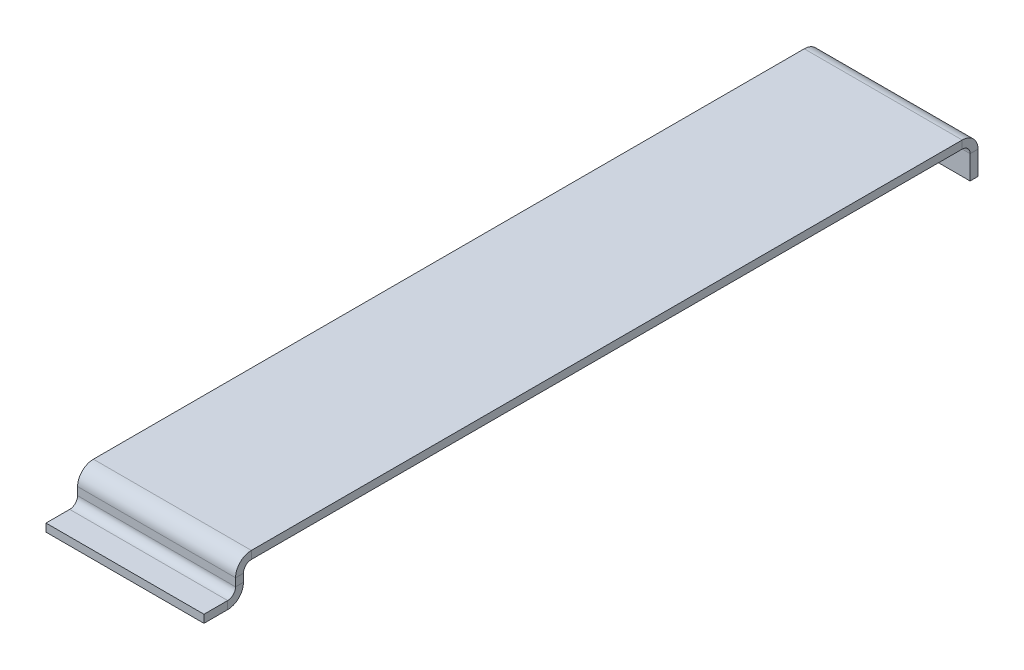
ISO-10303-21;
HEADER;
FILE_DESCRIPTION(('STEP AP214'),'2;1');
FILE_NAME('part.step','',(''),(''),'','','');
FILE_SCHEMA(('AUTOMOTIVE_DESIGN { 1 0 10303 214 1 1 1 1 }'));
ENDSEC;
DATA;
#1=APPLICATION_CONTEXT('core data for automotive mechanical design processes');
#2=APPLICATION_PROTOCOL_DEFINITION('international standard','automotive_design',2000,#1);
#3=PRODUCT_CONTEXT('',#1,'mechanical');
#4=PRODUCT('Part','Part','',(#3));
#5=PRODUCT_RELATED_PRODUCT_CATEGORY('part','',(#4));
#6=PRODUCT_DEFINITION_FORMATION('','',#4);
#7=PRODUCT_DEFINITION_CONTEXT('part definition',#1,'design');
#8=PRODUCT_DEFINITION('design','',#6,#7);
#9=PRODUCT_DEFINITION_SHAPE('','',#8);
#10=(LENGTH_UNIT() NAMED_UNIT(*) SI_UNIT(.MILLI.,.METRE.));
#11=(NAMED_UNIT(*) PLANE_ANGLE_UNIT() SI_UNIT($,.RADIAN.));
#12=(NAMED_UNIT(*) SI_UNIT($,.STERADIAN.) SOLID_ANGLE_UNIT());
#13=UNCERTAINTY_MEASURE_WITH_UNIT(LENGTH_MEASURE(1.E-05),#10,'distance_accuracy_value','');
#14=(GEOMETRIC_REPRESENTATION_CONTEXT(3) GLOBAL_UNCERTAINTY_ASSIGNED_CONTEXT((#13)) GLOBAL_UNIT_ASSIGNED_CONTEXT((#10,
#11,#12)) REPRESENTATION_CONTEXT('',''));
#15=CARTESIAN_POINT('',(0.,0.,0.));
#16=DIRECTION('',(0.,0.,1.));
#17=DIRECTION('',(1.,0.,0.));
#18=AXIS2_PLACEMENT_3D('',#15,#16,#17);
#19=CARTESIAN_POINT('',(-20.,-9.99999999999999,94.));
#20=DIRECTION('',(1.,0.,0.));
#21=DIRECTION('',(0.,0.,-1.));
#22=AXIS2_PLACEMENT_3D('',#19,#20,#21);
#23=PLANE('',#22);
#24=DIRECTION('',(0.,0.,-1.));
#25=VECTOR('',#24,1.);
#26=CARTESIAN_POINT('',(-20.,-5.99999999999999,94.));
#27=LINE('',#26,#25);
#28=CARTESIAN_POINT('',(-20.,-5.99999999999999,94.));
#29=VERTEX_POINT('',#28);
#30=CARTESIAN_POINT('',(-20.,-5.99999999999998,92.));
#31=VERTEX_POINT('',#30);
#32=EDGE_CURVE('E269',#29,#31,#27,.T.);
#33=ORIENTED_EDGE('',*,*,#32,.F.);
#34=DIRECTION('',(0.,-1.,0.));
#35=VECTOR('',#34,1.);
#36=CARTESIAN_POINT('',(-20.,3.19233188353512E-13,94.));
#37=LINE('',#36,#35);
#38=CARTESIAN_POINT('',(-20.,-3.99999999999999,94.));
#39=VERTEX_POINT('',#38);
#40=EDGE_CURVE('E319',#39,#29,#37,.T.);
#41=ORIENTED_EDGE('',*,*,#40,.F.);
#42=DIRECTION('',(0.,0.,-1.));
#43=VECTOR('',#42,1.);
#44=CARTESIAN_POINT('',(-20.,-3.99999999999999,92.));
#45=LINE('',#44,#43);
#46=CARTESIAN_POINT('',(-20.,-3.99999999999998,92.));
#47=VERTEX_POINT('',#46);
#48=EDGE_CURVE('E329',#47,#39,#45,.F.);
#49=ORIENTED_EDGE('',*,*,#48,.F.);
#50=DIRECTION('',(0.,1.,0.));
#51=VECTOR('',#50,1.);
#52=CARTESIAN_POINT('',(-20.,-9.99999999999999,92.));
#53=LINE('',#52,#51);
#54=EDGE_CURVE('E324',#47,#31,#53,.F.);
#55=ORIENTED_EDGE('',*,*,#54,.T.);
#56=EDGE_LOOP('',(#33,#41,#49,#55));
#57=FACE_BOUND('',#56,.T.);
#58=ADVANCED_FACE('F97',(#57),#23,.F.);
#59=CARTESIAN_POINT('',(20.,-1.99999999999999,94.));
#60=DIRECTION('',(-1.,0.,0.));
#61=DIRECTION('',(0.,0.,1.));
#62=AXIS2_PLACEMENT_3D('',#59,#60,#61);
#63=PLANE('',#62);
#64=DIRECTION('',(0.,0.,-1.));
#65=VECTOR('',#64,1.);
#66=CARTESIAN_POINT('',(20.,-5.99999999999999,94.));
#67=LINE('',#66,#65);
#68=CARTESIAN_POINT('',(20.,-5.99999999999999,94.));
#69=VERTEX_POINT('',#68);
#70=CARTESIAN_POINT('',(20.,-6.,92.));
#71=VERTEX_POINT('',#70);
#72=EDGE_CURVE('E258',#69,#71,#67,.T.);
#73=ORIENTED_EDGE('',*,*,#72,.T.);
#74=DIRECTION('',(0.,-1.,0.));
#75=VECTOR('',#74,1.);
#76=CARTESIAN_POINT('',(20.,-2.,92.));
#77=LINE('',#76,#75);
#78=CARTESIAN_POINT('',(20.,-3.99999999999998,92.));
#79=VERTEX_POINT('',#78);
#80=EDGE_CURVE('E322',#71,#79,#77,.F.);
#81=ORIENTED_EDGE('',*,*,#80,.T.);
#82=DIRECTION('',(0.,0.,-1.));
#83=VECTOR('',#82,1.);
#84=CARTESIAN_POINT('',(20.,-3.99999999999999,94.));
#85=LINE('',#84,#83);
#86=CARTESIAN_POINT('',(20.,-3.99999999999998,94.));
#87=VERTEX_POINT('',#86);
#88=EDGE_CURVE('E307',#79,#87,#85,.F.);
#89=ORIENTED_EDGE('',*,*,#88,.T.);
#90=DIRECTION('',(0.,1.,0.));
#91=VECTOR('',#90,1.);
#92=CARTESIAN_POINT('',(20.,3.19233188353512E-13,94.));
#93=LINE('',#92,#91);
#94=EDGE_CURVE('E316',#69,#87,#93,.T.);
#95=ORIENTED_EDGE('',*,*,#94,.F.);
#96=EDGE_LOOP('',(#73,#81,#89,#95));
#97=FACE_BOUND('',#96,.T.);
#98=ADVANCED_FACE('F405',(#97),#63,.F.);
#99=CARTESIAN_POINT('',(0.,3.19233188353512E-13,94.));
#100=DIRECTION('',(0.,0.,-1.));
#101=DIRECTION('',(0.,1.,0.));
#102=AXIS2_PLACEMENT_3D('',#99,#100,#101);
#103=PLANE('',#102);
#104=DIRECTION('',(1.,0.,0.));
#105=VECTOR('',#104,1.);
#106=CARTESIAN_POINT('',(20.,-5.99999999999999,94.));
#107=LINE('',#106,#105);
#108=EDGE_CURVE('E264',#69,#29,#107,.F.);
#109=ORIENTED_EDGE('',*,*,#108,.F.);
#110=ORIENTED_EDGE('',*,*,#94,.T.);
#111=DIRECTION('',(-1.,0.,0.));
#112=VECTOR('',#111,1.);
#113=CARTESIAN_POINT('',(20.,-3.99999999999999,94.));
#114=LINE('',#113,#112);
#115=EDGE_CURVE('E327',#39,#87,#114,.F.);
#116=ORIENTED_EDGE('',*,*,#115,.F.);
#117=ORIENTED_EDGE('',*,*,#40,.T.);
#118=EDGE_LOOP('',(#109,#110,#116,#117));
#119=FACE_BOUND('',#118,.T.);
#120=ADVANCED_FACE('F415',(#119),#103,.F.);
#121=CARTESIAN_POINT('',(0.,3.12250225675826E-13,92.));
#122=DIRECTION('',(0.,0.,-1.));
#123=DIRECTION('',(0.,1.,0.));
#124=AXIS2_PLACEMENT_3D('',#121,#122,#123);
#125=PLANE('',#124);
#126=ORIENTED_EDGE('',*,*,#80,.F.);
#127=DIRECTION('',(1.,0.,0.));
#128=VECTOR('',#127,1.);
#129=CARTESIAN_POINT('',(20.,-6.,92.));
#130=LINE('',#129,#128);
#131=EDGE_CURVE('E253',#71,#31,#130,.F.);
#132=ORIENTED_EDGE('',*,*,#131,.T.);
#133=ORIENTED_EDGE('',*,*,#54,.F.);
#134=DIRECTION('',(-1.,0.,0.));
#135=VECTOR('',#134,1.);
#136=CARTESIAN_POINT('',(20.,-3.99999999999999,92.));
#137=LINE('',#136,#135);
#138=EDGE_CURVE('E332',#79,#47,#137,.T.);
#139=ORIENTED_EDGE('',*,*,#138,.F.);
#140=EDGE_LOOP('',(#126,#132,#133,#139));
#141=FACE_BOUND('',#140,.T.);
#142=ADVANCED_FACE('F408',(#141),#125,.T.);
#143=CARTESIAN_POINT('',(20.,-2.,-90.));
#144=DIRECTION('',(1.,0.,0.));
#145=DIRECTION('',(0.,0.,-1.));
#146=AXIS2_PLACEMENT_3D('',#143,#144,#145);
#147=PLANE('',#146);
#148=DIRECTION('',(0.,0.,-1.));
#149=VECTOR('',#148,1.);
#150=CARTESIAN_POINT('',(20.,0.,-90.));
#151=LINE('',#150,#149);
#152=CARTESIAN_POINT('',(20.,0.,90.));
#153=VERTEX_POINT('',#152);
#154=CARTESIAN_POINT('',(20.,0.,-90.));
#155=VERTEX_POINT('',#154);
#156=EDGE_CURVE('E337',#153,#155,#151,.T.);
#157=ORIENTED_EDGE('',*,*,#156,.F.);
#158=DIRECTION('',(0.,1.,0.));
#159=VECTOR('',#158,1.);
#160=CARTESIAN_POINT('',(20.,-2.,90.));
#161=LINE('',#160,#159);
#162=CARTESIAN_POINT('',(20.,-2.00000000000002,90.));
#163=VERTEX_POINT('',#162);
#164=EDGE_CURVE('E13',#163,#153,#161,.T.);
#165=ORIENTED_EDGE('',*,*,#164,.F.);
#166=DIRECTION('',(0.,0.,-1.));
#167=VECTOR('',#166,1.);
#168=CARTESIAN_POINT('',(20.,-2.,-90.));
#169=LINE('',#168,#167);
#170=CARTESIAN_POINT('',(20.,-2.00000000000003,-90.));
#171=VERTEX_POINT('',#170);
#172=EDGE_CURVE('E346',#163,#171,#169,.T.);
#173=ORIENTED_EDGE('',*,*,#172,.T.);
#174=DIRECTION('',(0.,1.,0.));
#175=VECTOR('',#174,1.);
#176=CARTESIAN_POINT('',(20.,-2.,-90.));
#177=LINE('',#176,#175);
#178=EDGE_CURVE('E101',#171,#155,#177,.T.);
#179=ORIENTED_EDGE('',*,*,#178,.T.);
#180=EDGE_LOOP('',(#157,#165,#173,#179));
#181=FACE_BOUND('',#180,.T.);
#182=ADVANCED_FACE('F99',(#181),#147,.T.);
#183=CARTESIAN_POINT('',(-20.,-2.,-90.));
#184=DIRECTION('',(-1.,0.,0.));
#185=DIRECTION('',(0.,0.,1.));
#186=AXIS2_PLACEMENT_3D('',#183,#184,#185);
#187=PLANE('',#186);
#188=DIRECTION('',(0.,0.,1.));
#189=VECTOR('',#188,1.);
#190=CARTESIAN_POINT('',(-20.,0.,-90.));
#191=LINE('',#190,#189);
#192=CARTESIAN_POINT('',(-20.,0.,-90.));
#193=VERTEX_POINT('',#192);
#194=CARTESIAN_POINT('',(-20.,0.,90.));
#195=VERTEX_POINT('',#194);
#196=EDGE_CURVE('E362',#193,#195,#191,.T.);
#197=ORIENTED_EDGE('',*,*,#196,.F.);
#198=DIRECTION('',(0.,1.,0.));
#199=VECTOR('',#198,1.);
#200=CARTESIAN_POINT('',(-20.,-2.,-90.));
#201=LINE('',#200,#199);
#202=CARTESIAN_POINT('',(-20.,-2.00000000000003,-90.));
#203=VERTEX_POINT('',#202);
#204=EDGE_CURVE('E368',#203,#193,#201,.T.);
#205=ORIENTED_EDGE('',*,*,#204,.F.);
#206=DIRECTION('',(0.,0.,1.));
#207=VECTOR('',#206,1.);
#208=CARTESIAN_POINT('',(-20.,-2.,-90.));
#209=LINE('',#208,#207);
#210=CARTESIAN_POINT('',(-20.,-2.00000000000002,90.));
#211=VERTEX_POINT('',#210);
#212=EDGE_CURVE('E352',#203,#211,#209,.T.);
#213=ORIENTED_EDGE('',*,*,#212,.T.);
#214=DIRECTION('',(0.,1.,0.));
#215=VECTOR('',#214,1.);
#216=CARTESIAN_POINT('',(-20.,-2.,90.));
#217=LINE('',#216,#215);
#218=EDGE_CURVE('E106',#211,#195,#217,.T.);
#219=ORIENTED_EDGE('',*,*,#218,.T.);
#220=EDGE_LOOP('',(#197,#205,#213,#219));
#221=FACE_BOUND('',#220,.T.);
#222=ADVANCED_FACE('F390',(#221),#187,.T.);
#223=CARTESIAN_POINT('',(0.,-2.,0.));
#224=DIRECTION('',(0.,1.,0.));
#225=DIRECTION('',(0.,0.,1.));
#226=AXIS2_PLACEMENT_3D('',#223,#224,#225);
#227=PLANE('',#226);
#228=ORIENTED_EDGE('',*,*,#172,.F.);
#229=DIRECTION('',(1.,0.,0.));
#230=VECTOR('',#229,1.);
#231=CARTESIAN_POINT('',(-20.,-2.,90.));
#232=LINE('',#231,#230);
#233=EDGE_CURVE('E355',#211,#163,#232,.T.);
#234=ORIENTED_EDGE('',*,*,#233,.F.);
#235=ORIENTED_EDGE('',*,*,#212,.F.);
#236=DIRECTION('',(-1.,0.,0.));
#237=VECTOR('',#236,1.);
#238=CARTESIAN_POINT('',(-20.,-2.,-90.));
#239=LINE('',#238,#237);
#240=EDGE_CURVE('E349',#171,#203,#239,.T.);
#241=ORIENTED_EDGE('',*,*,#240,.F.);
#242=EDGE_LOOP('',(#228,#234,#235,#241));
#243=FACE_BOUND('',#242,.T.);
#244=ADVANCED_FACE('F395',(#243),#227,.F.);
#245=CARTESIAN_POINT('',(0.,0.,0.));
#246=DIRECTION('',(0.,1.,0.));
#247=DIRECTION('',(0.,0.,1.));
#248=AXIS2_PLACEMENT_3D('',#245,#246,#247);
#249=PLANE('',#248);
#250=ORIENTED_EDGE('',*,*,#156,.T.);
#251=DIRECTION('',(-1.,0.,0.));
#252=VECTOR('',#251,1.);
#253=CARTESIAN_POINT('',(-20.,0.,-90.));
#254=LINE('',#253,#252);
#255=EDGE_CURVE('E359',#155,#193,#254,.T.);
#256=ORIENTED_EDGE('',*,*,#255,.T.);
#257=ORIENTED_EDGE('',*,*,#196,.T.);
#258=DIRECTION('',(1.,0.,0.));
#259=VECTOR('',#258,1.);
#260=CARTESIAN_POINT('',(-20.,0.,90.));
#261=LINE('',#260,#259);
#262=EDGE_CURVE('E350',#195,#153,#261,.T.);
#263=ORIENTED_EDGE('',*,*,#262,.T.);
#264=EDGE_LOOP('',(#250,#256,#257,#263));
#265=FACE_BOUND('',#264,.T.);
#266=ADVANCED_FACE('F382',(#265),#249,.T.);
#267=CARTESIAN_POINT('',(20.,-3.99999999999999,90.));
#268=DIRECTION('',(1.,0.,0.));
#269=DIRECTION('',(0.,0.,-1.));
#270=AXIS2_PLACEMENT_3D('',#267,#268,#269);
#271=PLANE('',#270);
#272=ORIENTED_EDGE('',*,*,#88,.F.);
#273=CARTESIAN_POINT('',(20.,-3.99999999999999,90.));
#274=DIRECTION('',(-1.,0.,0.));
#275=DIRECTION('',(0.,0.,1.));
#276=AXIS2_PLACEMENT_3D('',#273,#274,#275);
#277=CIRCLE('',#276,1.99999999999997);
#278=EDGE_CURVE('E341',#163,#79,#277,.F.);
#279=ORIENTED_EDGE('',*,*,#278,.F.);
#280=ORIENTED_EDGE('',*,*,#164,.T.);
#281=CARTESIAN_POINT('',(20.,-3.99999999999999,90.));
#282=DIRECTION('',(-1.,0.,0.));
#283=DIRECTION('',(0.,0.,1.));
#284=AXIS2_PLACEMENT_3D('',#281,#282,#283);
#285=CIRCLE('',#284,3.99999999999997);
#286=EDGE_CURVE('E122',#153,#87,#285,.F.);
#287=ORIENTED_EDGE('',*,*,#286,.T.);
#288=EDGE_LOOP('',(#272,#279,#280,#287));
#289=FACE_BOUND('',#288,.T.);
#290=ADVANCED_FACE('F402',(#289),#271,.T.);
#291=CARTESIAN_POINT('',(-20.,-3.99999999999999,90.));
#292=DIRECTION('',(1.,0.,0.));
#293=DIRECTION('',(0.,0.,-1.));
#294=AXIS2_PLACEMENT_3D('',#291,#292,#293);
#295=PLANE('',#294);
#296=CARTESIAN_POINT('',(-20.,-3.99999999999999,90.));
#297=DIRECTION('',(-1.,0.,0.));
#298=DIRECTION('',(0.,0.,1.));
#299=AXIS2_PLACEMENT_3D('',#296,#297,#298);
#300=CIRCLE('',#299,1.99999999999997);
#301=EDGE_CURVE('E318',#47,#211,#300,.T.);
#302=ORIENTED_EDGE('',*,*,#301,.F.);
#303=ORIENTED_EDGE('',*,*,#48,.T.);
#304=CARTESIAN_POINT('',(-20.,-3.99999999999999,90.));
#305=DIRECTION('',(-1.,0.,0.));
#306=DIRECTION('',(0.,0.,1.));
#307=AXIS2_PLACEMENT_3D('',#304,#305,#306);
#308=CIRCLE('',#307,3.99999999999997);
#309=EDGE_CURVE('E338',#39,#195,#308,.T.);
#310=ORIENTED_EDGE('',*,*,#309,.T.);
#311=ORIENTED_EDGE('',*,*,#218,.F.);
#312=EDGE_LOOP('',(#302,#303,#310,#311));
#313=FACE_BOUND('',#312,.T.);
#314=ADVANCED_FACE('F386',(#313),#295,.F.);
#315=CARTESIAN_POINT('',(-20.,-3.99999999999999,90.));
#316=DIRECTION('',(-1.,0.,0.));
#317=DIRECTION('',(0.,0.,1.));
#318=AXIS2_PLACEMENT_3D('',#315,#316,#317);
#319=CYLINDRICAL_SURFACE('',#318,3.99999999999997);
#320=ORIENTED_EDGE('',*,*,#262,.F.);
#321=ORIENTED_EDGE('',*,*,#309,.F.);
#322=ORIENTED_EDGE('',*,*,#115,.T.);
#323=ORIENTED_EDGE('',*,*,#286,.F.);
#324=EDGE_LOOP('',(#320,#321,#322,#323));
#325=FACE_BOUND('',#324,.T.);
#326=ADVANCED_FACE('F383',(#325),#319,.T.);
#327=CARTESIAN_POINT('',(-20.,-3.99999999999999,90.));
#328=DIRECTION('',(-1.,0.,0.));
#329=DIRECTION('',(0.,0.,1.));
#330=AXIS2_PLACEMENT_3D('',#327,#328,#329);
#331=CYLINDRICAL_SURFACE('',#330,1.99999999999997);
#332=ORIENTED_EDGE('',*,*,#233,.T.);
#333=ORIENTED_EDGE('',*,*,#278,.T.);
#334=ORIENTED_EDGE('',*,*,#138,.T.);
#335=ORIENTED_EDGE('',*,*,#301,.T.);
#336=EDGE_LOOP('',(#332,#333,#334,#335));
#337=FACE_BOUND('',#336,.T.);
#338=ADVANCED_FACE('F398',(#337),#331,.F.);
#339=CARTESIAN_POINT('',(-20.,-4.,-90.));
#340=DIRECTION('',(-1.,0.,0.));
#341=DIRECTION('',(0.,0.,1.));
#342=AXIS2_PLACEMENT_3D('',#339,#340,#341);
#343=PLANE('',#342);
#344=DIRECTION('',(0.,0.,1.));
#345=VECTOR('',#344,1.);
#346=CARTESIAN_POINT('',(-20.,-3.99999999999998,-94.));
#347=LINE('',#346,#345);
#348=CARTESIAN_POINT('',(-20.,-4.,-91.9999999999999));
#349=VERTEX_POINT('',#348);
#350=CARTESIAN_POINT('',(-20.,-3.99999999999999,-93.9999999999999));
#351=VERTEX_POINT('',#350);
#352=EDGE_CURVE('E271',#349,#351,#347,.F.);
#353=ORIENTED_EDGE('',*,*,#352,.F.);
#354=CARTESIAN_POINT('',(-20.,-4.,-90.));
#355=DIRECTION('',(1.,0.,0.));
#356=DIRECTION('',(0.,0.,-1.));
#357=AXIS2_PLACEMENT_3D('',#354,#355,#356);
#358=CIRCLE('',#357,1.99999999999997);
#359=EDGE_CURVE('E311',#203,#349,#358,.F.);
#360=ORIENTED_EDGE('',*,*,#359,.F.);
#361=ORIENTED_EDGE('',*,*,#204,.T.);
#362=CARTESIAN_POINT('',(-20.,-4.,-90.));
#363=DIRECTION('',(1.,0.,0.));
#364=DIRECTION('',(0.,0.,-1.));
#365=AXIS2_PLACEMENT_3D('',#362,#363,#364);
#366=CIRCLE('',#365,3.99999999999997);
#367=EDGE_CURVE('E304',#193,#351,#366,.F.);
#368=ORIENTED_EDGE('',*,*,#367,.T.);
#369=EDGE_LOOP('',(#353,#360,#361,#368));
#370=FACE_BOUND('',#369,.T.);
#371=ADVANCED_FACE('F450',(#370),#343,.T.);
#372=CARTESIAN_POINT('',(20.,-4.,-90.));
#373=DIRECTION('',(-1.,0.,0.));
#374=DIRECTION('',(0.,0.,1.));
#375=AXIS2_PLACEMENT_3D('',#372,#373,#374);
#376=PLANE('',#375);
#377=CARTESIAN_POINT('',(20.,-4.,-90.));
#378=DIRECTION('',(1.,0.,0.));
#379=DIRECTION('',(0.,0.,-1.));
#380=AXIS2_PLACEMENT_3D('',#377,#378,#379);
#381=CIRCLE('',#380,1.99999999999997);
#382=CARTESIAN_POINT('',(20.,-4.,-91.9999999999999));
#383=VERTEX_POINT('',#382);
#384=EDGE_CURVE('E277',#383,#171,#381,.T.);
#385=ORIENTED_EDGE('',*,*,#384,.F.);
#386=DIRECTION('',(0.,0.,1.));
#387=VECTOR('',#386,1.);
#388=CARTESIAN_POINT('',(20.,-3.99999999999999,-92.));
#389=LINE('',#388,#387);
#390=CARTESIAN_POINT('',(20.,-3.99999999999998,-94.));
#391=VERTEX_POINT('',#390);
#392=EDGE_CURVE('E297',#383,#391,#389,.F.);
#393=ORIENTED_EDGE('',*,*,#392,.T.);
#394=CARTESIAN_POINT('',(20.,-4.,-90.));
#395=DIRECTION('',(1.,0.,0.));
#396=DIRECTION('',(0.,0.,-1.));
#397=AXIS2_PLACEMENT_3D('',#394,#395,#396);
#398=CIRCLE('',#397,3.99999999999997);
#399=EDGE_CURVE('E308',#391,#155,#398,.T.);
#400=ORIENTED_EDGE('',*,*,#399,.T.);
#401=ORIENTED_EDGE('',*,*,#178,.F.);
#402=EDGE_LOOP('',(#385,#393,#400,#401));
#403=FACE_BOUND('',#402,.T.);
#404=ADVANCED_FACE('F470',(#403),#376,.F.);
#405=CARTESIAN_POINT('',(20.,-4.,-90.));
#406=DIRECTION('',(1.,0.,0.));
#407=DIRECTION('',(0.,0.,-1.));
#408=AXIS2_PLACEMENT_3D('',#405,#406,#407);
#409=CYLINDRICAL_SURFACE('',#408,3.99999999999997);
#410=ORIENTED_EDGE('',*,*,#255,.F.);
#411=ORIENTED_EDGE('',*,*,#399,.F.);
#412=DIRECTION('',(1.,0.,0.));
#413=VECTOR('',#412,1.);
#414=CARTESIAN_POINT('',(-20.,-3.99999999999998,-94.));
#415=LINE('',#414,#413);
#416=EDGE_CURVE('E295',#391,#351,#415,.F.);
#417=ORIENTED_EDGE('',*,*,#416,.T.);
#418=ORIENTED_EDGE('',*,*,#367,.F.);
#419=EDGE_LOOP('',(#410,#411,#417,#418));
#420=FACE_BOUND('',#419,.T.);
#421=ADVANCED_FACE('F473',(#420),#409,.T.);
#422=CARTESIAN_POINT('',(20.,-4.,-90.));
#423=DIRECTION('',(1.,0.,0.));
#424=DIRECTION('',(0.,0.,-1.));
#425=AXIS2_PLACEMENT_3D('',#422,#423,#424);
#426=CYLINDRICAL_SURFACE('',#425,1.99999999999997);
#427=ORIENTED_EDGE('',*,*,#240,.T.);
#428=ORIENTED_EDGE('',*,*,#359,.T.);
#429=DIRECTION('',(1.,0.,0.));
#430=VECTOR('',#429,1.);
#431=CARTESIAN_POINT('',(-20.,-3.99999999999999,-92.));
#432=LINE('',#431,#430);
#433=EDGE_CURVE('E300',#349,#383,#432,.T.);
#434=ORIENTED_EDGE('',*,*,#433,.T.);
#435=ORIENTED_EDGE('',*,*,#384,.T.);
#436=EDGE_LOOP('',(#427,#428,#434,#435));
#437=FACE_BOUND('',#436,.T.);
#438=ADVANCED_FACE('F476',(#437),#426,.F.);
#439=CARTESIAN_POINT('',(20.,-9.99999999999999,-94.));
#440=DIRECTION('',(-1.,0.,0.));
#441=DIRECTION('',(0.,0.,1.));
#442=AXIS2_PLACEMENT_3D('',#439,#440,#441);
#443=PLANE('',#442);
#444=ORIENTED_EDGE('',*,*,#392,.F.);
#445=DIRECTION('',(0.,1.,0.));
#446=VECTOR('',#445,1.);
#447=CARTESIAN_POINT('',(20.,-9.99999999999999,-92.));
#448=LINE('',#447,#446);
#449=CARTESIAN_POINT('',(20.,-9.99999999999999,-92.));
#450=VERTEX_POINT('',#449);
#451=EDGE_CURVE('E293',#383,#450,#448,.F.);
#452=ORIENTED_EDGE('',*,*,#451,.T.);
#453=DIRECTION('',(0.,0.,1.));
#454=VECTOR('',#453,1.);
#455=CARTESIAN_POINT('',(20.,-9.99999999999999,-94.));
#456=LINE('',#455,#454);
#457=CARTESIAN_POINT('',(20.,-9.99999999999999,-94.));
#458=VERTEX_POINT('',#457);
#459=EDGE_CURVE('E274',#458,#450,#456,.T.);
#460=ORIENTED_EDGE('',*,*,#459,.F.);
#461=DIRECTION('',(0.,-1.,0.));
#462=VECTOR('',#461,1.);
#463=CARTESIAN_POINT('',(20.,3.19233188353512E-13,-93.9999999999999));
#464=LINE('',#463,#462);
#465=EDGE_CURVE('E286',#391,#458,#464,.T.);
#466=ORIENTED_EDGE('',*,*,#465,.F.);
#467=EDGE_LOOP('',(#444,#452,#460,#466));
#468=FACE_BOUND('',#467,.T.);
#469=ADVANCED_FACE('F479',(#468),#443,.F.);
#470=CARTESIAN_POINT('',(-20.,-1.99999999999999,-94.));
#471=DIRECTION('',(1.,0.,0.));
#472=DIRECTION('',(0.,0.,-1.));
#473=AXIS2_PLACEMENT_3D('',#470,#471,#472);
#474=PLANE('',#473);
#475=ORIENTED_EDGE('',*,*,#352,.T.);
#476=DIRECTION('',(0.,1.,0.));
#477=VECTOR('',#476,1.);
#478=CARTESIAN_POINT('',(-20.,3.19233188353512E-13,-93.9999999999999));
#479=LINE('',#478,#477);
#480=CARTESIAN_POINT('',(-20.,-9.99999999999999,-94.));
#481=VERTEX_POINT('',#480);
#482=EDGE_CURVE('E281',#481,#351,#479,.T.);
#483=ORIENTED_EDGE('',*,*,#482,.F.);
#484=DIRECTION('',(0.,0.,1.));
#485=VECTOR('',#484,1.);
#486=CARTESIAN_POINT('',(-20.,-9.99999999999999,-94.));
#487=LINE('',#486,#485);
#488=CARTESIAN_POINT('',(-20.,-9.99999999999999,-92.));
#489=VERTEX_POINT('',#488);
#490=EDGE_CURVE('E278',#481,#489,#487,.T.);
#491=ORIENTED_EDGE('',*,*,#490,.T.);
#492=DIRECTION('',(0.,-1.,0.));
#493=VECTOR('',#492,1.);
#494=CARTESIAN_POINT('',(-20.,-2.,-91.9999999999999));
#495=LINE('',#494,#493);
#496=EDGE_CURVE('E288',#489,#349,#495,.F.);
#497=ORIENTED_EDGE('',*,*,#496,.T.);
#498=EDGE_LOOP('',(#475,#483,#491,#497));
#499=FACE_BOUND('',#498,.T.);
#500=ADVANCED_FACE('F485',(#499),#474,.F.);
#501=CARTESIAN_POINT('',(0.,3.19233188353512E-13,-93.9999999999999));
#502=DIRECTION('',(0.,0.,1.));
#503=DIRECTION('',(0.,-1.,0.));
#504=AXIS2_PLACEMENT_3D('',#501,#502,#503);
#505=PLANE('',#504);
#506=ORIENTED_EDGE('',*,*,#416,.F.);
#507=ORIENTED_EDGE('',*,*,#465,.T.);
#508=DIRECTION('',(-1.,0.,0.));
#509=VECTOR('',#508,1.);
#510=CARTESIAN_POINT('',(0.,-9.99999999999999,-94.));
#511=LINE('',#510,#509);
#512=EDGE_CURVE('E284',#458,#481,#511,.T.);
#513=ORIENTED_EDGE('',*,*,#512,.T.);
#514=ORIENTED_EDGE('',*,*,#482,.T.);
#515=EDGE_LOOP('',(#506,#507,#513,#514));
#516=FACE_BOUND('',#515,.T.);
#517=ADVANCED_FACE('F490',(#516),#505,.F.);
#518=CARTESIAN_POINT('',(0.,3.12250225675825E-13,-91.9999999999999));
#519=DIRECTION('',(0.,0.,1.));
#520=DIRECTION('',(0.,-1.,0.));
#521=AXIS2_PLACEMENT_3D('',#518,#519,#520);
#522=PLANE('',#521);
#523=ORIENTED_EDGE('',*,*,#451,.F.);
#524=ORIENTED_EDGE('',*,*,#433,.F.);
#525=ORIENTED_EDGE('',*,*,#496,.F.);
#526=DIRECTION('',(1.,0.,0.));
#527=VECTOR('',#526,1.);
#528=CARTESIAN_POINT('',(-20.,-9.99999999999999,-92.));
#529=LINE('',#528,#527);
#530=EDGE_CURVE('E291',#450,#489,#529,.F.);
#531=ORIENTED_EDGE('',*,*,#530,.F.);
#532=EDGE_LOOP('',(#523,#524,#525,#531));
#533=FACE_BOUND('',#532,.T.);
#534=ADVANCED_FACE('F434',(#533),#522,.T.);
#535=CARTESIAN_POINT('',(-20.,-9.99999999999999,-94.));
#536=DIRECTION('',(0.,1.,0.));
#537=DIRECTION('',(0.,0.,1.));
#538=AXIS2_PLACEMENT_3D('',#535,#536,#537);
#539=PLANE('',#538);
#540=ORIENTED_EDGE('',*,*,#530,.T.);
#541=ORIENTED_EDGE('',*,*,#490,.F.);
#542=ORIENTED_EDGE('',*,*,#512,.F.);
#543=ORIENTED_EDGE('',*,*,#459,.T.);
#544=EDGE_LOOP('',(#540,#541,#542,#543));
#545=FACE_BOUND('',#544,.T.);
#546=ADVANCED_FACE('F425',(#545),#539,.F.);
#547=CARTESIAN_POINT('',(-20.,-5.99999999999999,96.));
#548=DIRECTION('',(-1.,0.,0.));
#549=DIRECTION('',(0.,0.,1.));
#550=AXIS2_PLACEMENT_3D('',#547,#548,#549);
#551=PLANE('',#550);
#552=DIRECTION('',(0.,1.,0.));
#553=VECTOR('',#552,1.);
#554=CARTESIAN_POINT('',(-20.,-9.99999999999999,96.));
#555=LINE('',#554,#553);
#556=CARTESIAN_POINT('',(-20.,-7.99999999999999,96.));
#557=VERTEX_POINT('',#556);
#558=CARTESIAN_POINT('',(-20.,-9.99999999999999,96.));
#559=VERTEX_POINT('',#558);
#560=EDGE_CURVE('E236',#557,#559,#555,.F.);
#561=ORIENTED_EDGE('',*,*,#560,.F.);
#562=CARTESIAN_POINT('',(-20.,-5.99999999999999,96.));
#563=DIRECTION('',(1.,0.,0.));
#564=DIRECTION('',(0.,0.,-1.));
#565=AXIS2_PLACEMENT_3D('',#562,#563,#564);
#566=CIRCLE('',#565,2.);
#567=EDGE_CURVE('E261',#29,#557,#566,.F.);
#568=ORIENTED_EDGE('',*,*,#567,.F.);
#569=ORIENTED_EDGE('',*,*,#32,.T.);
#570=CARTESIAN_POINT('',(-20.,-5.99999999999999,96.));
#571=DIRECTION('',(1.,0.,0.));
#572=DIRECTION('',(0.,0.,-1.));
#573=AXIS2_PLACEMENT_3D('',#570,#571,#572);
#574=CIRCLE('',#573,4.);
#575=EDGE_CURVE('E114',#31,#559,#574,.F.);
#576=ORIENTED_EDGE('',*,*,#575,.T.);
#577=EDGE_LOOP('',(#561,#568,#569,#576));
#578=FACE_BOUND('',#577,.T.);
#579=ADVANCED_FACE('F422',(#578),#551,.T.);
#580=CARTESIAN_POINT('',(20.,-5.99999999999999,96.));
#581=DIRECTION('',(-1.,0.,0.));
#582=DIRECTION('',(0.,0.,1.));
#583=AXIS2_PLACEMENT_3D('',#580,#581,#582);
#584=PLANE('',#583);
#585=CARTESIAN_POINT('',(20.,-5.99999999999999,96.));
#586=DIRECTION('',(1.,0.,0.));
#587=DIRECTION('',(0.,0.,-1.));
#588=AXIS2_PLACEMENT_3D('',#585,#586,#587);
#589=CIRCLE('',#588,2.);
#590=CARTESIAN_POINT('',(20.,-7.99999999999999,96.));
#591=VERTEX_POINT('',#590);
#592=EDGE_CURVE('E266',#591,#69,#589,.T.);
#593=ORIENTED_EDGE('',*,*,#592,.F.);
#594=DIRECTION('',(0.,1.,0.));
#595=VECTOR('',#594,1.);
#596=CARTESIAN_POINT('',(20.,-7.99999999999999,96.));
#597=LINE('',#596,#595);
#598=CARTESIAN_POINT('',(20.,-9.99999999999999,96.));
#599=VERTEX_POINT('',#598);
#600=EDGE_CURVE('E247',#591,#599,#597,.F.);
#601=ORIENTED_EDGE('',*,*,#600,.T.);
#602=CARTESIAN_POINT('',(20.,-5.99999999999999,96.));
#603=DIRECTION('',(1.,0.,0.));
#604=DIRECTION('',(0.,0.,-1.));
#605=AXIS2_PLACEMENT_3D('',#602,#603,#604);
#606=CIRCLE('',#605,4.);
#607=EDGE_CURVE('E256',#599,#71,#606,.T.);
#608=ORIENTED_EDGE('',*,*,#607,.T.);
#609=ORIENTED_EDGE('',*,*,#72,.F.);
#610=EDGE_LOOP('',(#593,#601,#608,#609));
#611=FACE_BOUND('',#610,.T.);
#612=ADVANCED_FACE('F424',(#611),#584,.F.);
#613=CARTESIAN_POINT('',(20.,-5.99999999999999,96.));
#614=DIRECTION('',(1.,0.,0.));
#615=DIRECTION('',(0.,-1.,0.));
#616=AXIS2_PLACEMENT_3D('',#613,#614,#615);
#617=CYLINDRICAL_SURFACE('',#616,4.);
#618=ORIENTED_EDGE('',*,*,#131,.F.);
#619=ORIENTED_EDGE('',*,*,#607,.F.);
#620=DIRECTION('',(1.,0.,0.));
#621=VECTOR('',#620,1.);
#622=CARTESIAN_POINT('',(-20.,-9.99999999999999,96.));
#623=LINE('',#622,#621);
#624=EDGE_CURVE('E245',#599,#559,#623,.F.);
#625=ORIENTED_EDGE('',*,*,#624,.T.);
#626=ORIENTED_EDGE('',*,*,#575,.F.);
#627=EDGE_LOOP('',(#618,#619,#625,#626));
#628=FACE_BOUND('',#627,.T.);
#629=ADVANCED_FACE('F431',(#628),#617,.T.);
#630=CARTESIAN_POINT('',(20.,-5.99999999999999,96.));
#631=DIRECTION('',(1.,0.,0.));
#632=DIRECTION('',(0.,-1.,0.));
#633=AXIS2_PLACEMENT_3D('',#630,#631,#632);
#634=CYLINDRICAL_SURFACE('',#633,2.);
#635=ORIENTED_EDGE('',*,*,#108,.T.);
#636=ORIENTED_EDGE('',*,*,#567,.T.);
#637=DIRECTION('',(1.,0.,0.));
#638=VECTOR('',#637,1.);
#639=CARTESIAN_POINT('',(-20.,-7.99999999999999,96.));
#640=LINE('',#639,#638);
#641=EDGE_CURVE('E250',#557,#591,#640,.T.);
#642=ORIENTED_EDGE('',*,*,#641,.T.);
#643=ORIENTED_EDGE('',*,*,#592,.T.);
#644=EDGE_LOOP('',(#635,#636,#642,#643));
#645=FACE_BOUND('',#644,.T.);
#646=ADVANCED_FACE('F418',(#645),#634,.F.);
#647=CARTESIAN_POINT('',(-20.,-9.99999999999999,94.));
#648=DIRECTION('',(1.,0.,0.));
#649=DIRECTION('',(0.,0.,-1.));
#650=AXIS2_PLACEMENT_3D('',#647,#648,#649);
#651=PLANE('',#650);
#652=ORIENTED_EDGE('',*,*,#560,.T.);
#653=DIRECTION('',(0.,0.,-1.));
#654=VECTOR('',#653,1.);
#655=CARTESIAN_POINT('',(-20.,-9.99999999999999,0.));
#656=LINE('',#655,#654);
#657=CARTESIAN_POINT('',(-20.,-9.99999999999999,102.));
#658=VERTEX_POINT('',#657);
#659=EDGE_CURVE('E217',#658,#559,#656,.T.);
#660=ORIENTED_EDGE('',*,*,#659,.F.);
#661=DIRECTION('',(0.,1.,0.));
#662=VECTOR('',#661,1.);
#663=CARTESIAN_POINT('',(-20.,-9.99999999999999,102.));
#664=LINE('',#663,#662);
#665=CARTESIAN_POINT('',(-20.,-7.99999999999999,102.));
#666=VERTEX_POINT('',#665);
#667=EDGE_CURVE('E223',#658,#666,#664,.T.);
#668=ORIENTED_EDGE('',*,*,#667,.T.);
#669=DIRECTION('',(0.,0.,1.));
#670=VECTOR('',#669,1.);
#671=CARTESIAN_POINT('',(-20.,-7.99999999999999,94.));
#672=LINE('',#671,#670);
#673=EDGE_CURVE('E243',#666,#557,#672,.F.);
#674=ORIENTED_EDGE('',*,*,#673,.T.);
#675=EDGE_LOOP('',(#652,#660,#668,#674));
#676=FACE_BOUND('',#675,.T.);
#677=ADVANCED_FACE('F235',(#676),#651,.F.);
#678=CARTESIAN_POINT('',(20.,-9.99999999999999,102.));
#679=DIRECTION('',(-1.,0.,0.));
#680=DIRECTION('',(0.,0.,1.));
#681=AXIS2_PLACEMENT_3D('',#678,#679,#680);
#682=PLANE('',#681);
#683=ORIENTED_EDGE('',*,*,#600,.F.);
#684=DIRECTION('',(0.,0.,-1.));
#685=VECTOR('',#684,1.);
#686=CARTESIAN_POINT('',(20.,-7.99999999999999,102.));
#687=LINE('',#686,#685);
#688=CARTESIAN_POINT('',(20.,-7.99999999999999,102.));
#689=VERTEX_POINT('',#688);
#690=EDGE_CURVE('E239',#591,#689,#687,.F.);
#691=ORIENTED_EDGE('',*,*,#690,.T.);
#692=DIRECTION('',(0.,1.,0.));
#693=VECTOR('',#692,1.);
#694=CARTESIAN_POINT('',(20.,-9.99999999999999,102.));
#695=LINE('',#694,#693);
#696=CARTESIAN_POINT('',(20.,-9.99999999999999,102.));
#697=VERTEX_POINT('',#696);
#698=EDGE_CURVE('E232',#697,#689,#695,.T.);
#699=ORIENTED_EDGE('',*,*,#698,.F.);
#700=DIRECTION('',(0.,0.,1.));
#701=VECTOR('',#700,1.);
#702=CARTESIAN_POINT('',(20.,-9.99999999999999,0.));
#703=LINE('',#702,#701);
#704=EDGE_CURVE('E219',#599,#697,#703,.T.);
#705=ORIENTED_EDGE('',*,*,#704,.F.);
#706=EDGE_LOOP('',(#683,#691,#699,#705));
#707=FACE_BOUND('',#706,.T.);
#708=ADVANCED_FACE('F579',(#707),#682,.F.);
#709=CARTESIAN_POINT('',(0.,-9.99999999999999,0.));
#710=DIRECTION('',(0.,1.,0.));
#711=DIRECTION('',(0.,0.,1.));
#712=AXIS2_PLACEMENT_3D('',#709,#710,#711);
#713=PLANE('',#712);
#714=ORIENTED_EDGE('',*,*,#624,.F.);
#715=ORIENTED_EDGE('',*,*,#704,.T.);
#716=DIRECTION('',(-1.,0.,0.));
#717=VECTOR('',#716,1.);
#718=CARTESIAN_POINT('',(0.,-9.99999999999999,102.));
#719=LINE('',#718,#717);
#720=EDGE_CURVE('E212',#697,#658,#719,.T.);
#721=ORIENTED_EDGE('',*,*,#720,.T.);
#722=ORIENTED_EDGE('',*,*,#659,.T.);
#723=EDGE_LOOP('',(#714,#715,#721,#722));
#724=FACE_BOUND('',#723,.T.);
#725=ADVANCED_FACE('F215',(#724),#713,.F.);
#726=CARTESIAN_POINT('',(0.,-7.99999999999999,0.));
#727=DIRECTION('',(0.,1.,0.));
#728=DIRECTION('',(0.,0.,1.));
#729=AXIS2_PLACEMENT_3D('',#726,#727,#728);
#730=PLANE('',#729);
#731=ORIENTED_EDGE('',*,*,#690,.F.);
#732=ORIENTED_EDGE('',*,*,#641,.F.);
#733=ORIENTED_EDGE('',*,*,#673,.F.);
#734=DIRECTION('',(1.,0.,0.));
#735=VECTOR('',#734,1.);
#736=CARTESIAN_POINT('',(-20.,-7.99999999999999,102.));
#737=LINE('',#736,#735);
#738=EDGE_CURVE('E228',#689,#666,#737,.F.);
#739=ORIENTED_EDGE('',*,*,#738,.F.);
#740=EDGE_LOOP('',(#731,#732,#733,#739));
#741=FACE_BOUND('',#740,.T.);
#742=ADVANCED_FACE('F599',(#741),#730,.T.);
#743=CARTESIAN_POINT('',(-20.,-9.99999999999999,102.));
#744=DIRECTION('',(0.,0.,-1.));
#745=DIRECTION('',(0.,1.,0.));
#746=AXIS2_PLACEMENT_3D('',#743,#744,#745);
#747=PLANE('',#746);
#748=ORIENTED_EDGE('',*,*,#738,.T.);
#749=ORIENTED_EDGE('',*,*,#667,.F.);
#750=ORIENTED_EDGE('',*,*,#720,.F.);
#751=ORIENTED_EDGE('',*,*,#698,.T.);
#752=EDGE_LOOP('',(#748,#749,#750,#751));
#753=FACE_BOUND('',#752,.T.);
#754=ADVANCED_FACE('F226',(#753),#747,.F.);
#755=CLOSED_SHELL('',(#58,#98,#120,#142,#182,#222,#244,#266,#290,#314,#326,#338,#371,#404,#421,
#438,#469,#500,#517,#534,#546,#579,#612,#629,#646,#677,#708,#725,#742,#754));
#756=MANIFOLD_SOLID_BREP('B2',#755);
#757=ADVANCED_BREP_SHAPE_REPRESENTATION('',(#18,#756),#14);
#758=SHAPE_DEFINITION_REPRESENTATION(#9,#757);
ENDSEC;
END-ISO-10303-21;
